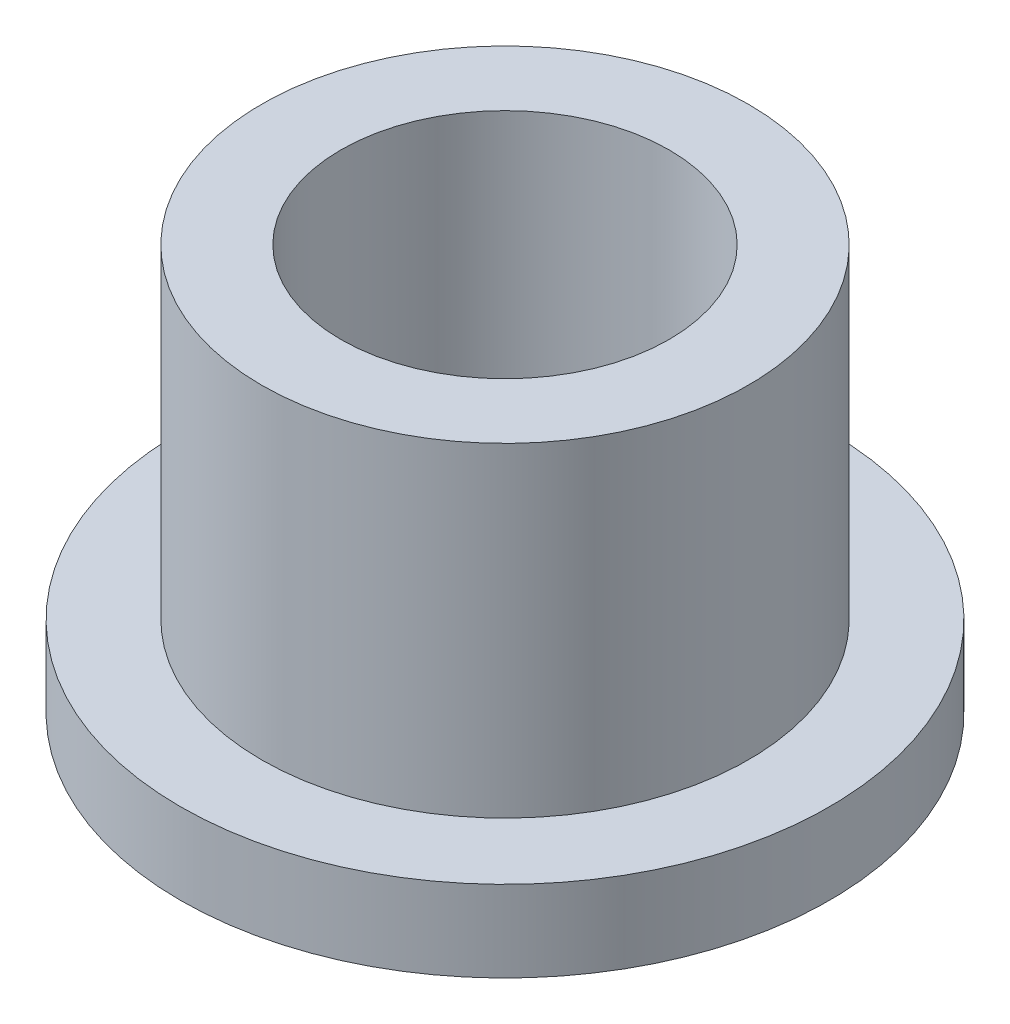
ISO-10303-21;
HEADER;
FILE_DESCRIPTION(('STEP AP214'),'2;1');
FILE_NAME('part.step','',(''),(''),'','','');
FILE_SCHEMA(('AUTOMOTIVE_DESIGN { 1 0 10303 214 1 1 1 1 }'));
ENDSEC;
DATA;
#1=APPLICATION_CONTEXT('core data for automotive mechanical design processes');
#2=APPLICATION_PROTOCOL_DEFINITION('international standard','automotive_design',2000,#1);
#3=PRODUCT_CONTEXT('',#1,'mechanical');
#4=PRODUCT('Part','Part','',(#3));
#5=PRODUCT_RELATED_PRODUCT_CATEGORY('part','',(#4));
#6=PRODUCT_DEFINITION_FORMATION('','',#4);
#7=PRODUCT_DEFINITION_CONTEXT('part definition',#1,'design');
#8=PRODUCT_DEFINITION('design','',#6,#7);
#9=PRODUCT_DEFINITION_SHAPE('','',#8);
#10=(LENGTH_UNIT() NAMED_UNIT(*) SI_UNIT(.MILLI.,.METRE.));
#11=(NAMED_UNIT(*) PLANE_ANGLE_UNIT() SI_UNIT($,.RADIAN.));
#12=(NAMED_UNIT(*) SI_UNIT($,.STERADIAN.) SOLID_ANGLE_UNIT());
#13=UNCERTAINTY_MEASURE_WITH_UNIT(LENGTH_MEASURE(1.E-05),#10,'distance_accuracy_value','');
#14=(GEOMETRIC_REPRESENTATION_CONTEXT(3) GLOBAL_UNCERTAINTY_ASSIGNED_CONTEXT((#13)) GLOBAL_UNIT_ASSIGNED_CONTEXT((#10,
#11,#12)) REPRESENTATION_CONTEXT('',''));
#15=CARTESIAN_POINT('',(0.,0.,0.));
#16=DIRECTION('',(0.,0.,1.));
#17=DIRECTION('',(1.,0.,0.));
#18=AXIS2_PLACEMENT_3D('',#15,#16,#17);
#19=CARTESIAN_POINT('',(0.,7.9375,0.));
#20=DIRECTION('',(0.,1.,0.));
#21=DIRECTION('',(0.,0.,1.));
#22=AXIS2_PLACEMENT_3D('',#19,#20,#21);
#23=PLANE('',#22);
#24=CARTESIAN_POINT('',(0.,7.9375,0.));
#25=DIRECTION('',(0.,1.,0.));
#26=DIRECTION('',(0.,0.,1.));
#27=AXIS2_PLACEMENT_3D('',#24,#25,#26);
#28=CIRCLE('',#27,4.7625);
#29=CARTESIAN_POINT('',(0.,7.9375,4.7625));
#30=VERTEX_POINT('',#29);
#31=EDGE_CURVE('E10',#30,#30,#28,.T.);
#32=ORIENTED_EDGE('',*,*,#31,.T.);
#33=EDGE_LOOP('',(#32));
#34=FACE_BOUND('',#33,.T.);
#35=CARTESIAN_POINT('',(0.,7.9375,0.));
#36=DIRECTION('',(0.,1.,0.));
#37=DIRECTION('',(0.,0.,1.));
#38=AXIS2_PLACEMENT_3D('',#35,#36,#37);
#39=CIRCLE('',#38,3.2131);
#40=CARTESIAN_POINT('',(0.,7.9375,3.2131));
#41=VERTEX_POINT('',#40);
#42=EDGE_CURVE('E37',#41,#41,#39,.T.);
#43=ORIENTED_EDGE('',*,*,#42,.F.);
#44=EDGE_LOOP('',(#43));
#45=FACE_BOUND('',#44,.T.);
#46=ADVANCED_FACE('F30',(#34,#45),#23,.T.);
#47=CARTESIAN_POINT('',(0.,0.,0.));
#48=DIRECTION('',(0.,1.,0.));
#49=DIRECTION('',(0.,0.,1.));
#50=AXIS2_PLACEMENT_3D('',#47,#48,#49);
#51=PLANE('',#50);
#52=CARTESIAN_POINT('',(0.,0.,0.));
#53=DIRECTION('',(0.,1.,0.));
#54=DIRECTION('',(0.,0.,1.));
#55=AXIS2_PLACEMENT_3D('',#52,#53,#54);
#56=CIRCLE('',#55,3.2131);
#57=CARTESIAN_POINT('',(0.,0.,3.2131));
#58=VERTEX_POINT('',#57);
#59=EDGE_CURVE('E41',#58,#58,#56,.T.);
#60=ORIENTED_EDGE('',*,*,#59,.T.);
#61=EDGE_LOOP('',(#60));
#62=FACE_BOUND('',#61,.T.);
#63=CARTESIAN_POINT('',(0.,0.,0.));
#64=DIRECTION('',(0.,1.,0.));
#65=DIRECTION('',(0.,0.,1.));
#66=AXIS2_PLACEMENT_3D('',#63,#64,#65);
#67=CIRCLE('',#66,6.35);
#68=CARTESIAN_POINT('',(0.,0.,6.35));
#69=VERTEX_POINT('',#68);
#70=EDGE_CURVE('E48',#69,#69,#67,.T.);
#71=ORIENTED_EDGE('',*,*,#70,.F.);
#72=EDGE_LOOP('',(#71));
#73=FACE_BOUND('',#72,.T.);
#74=ADVANCED_FACE('F73',(#62,#73),#51,.F.);
#75=CARTESIAN_POINT('',(0.,7.9375,0.));
#76=DIRECTION('',(0.,-1.,0.));
#77=DIRECTION('',(0.,0.,-1.));
#78=AXIS2_PLACEMENT_3D('',#75,#76,#77);
#79=CYLINDRICAL_SURFACE('',#78,4.7625);
#80=CARTESIAN_POINT('',(0.,1.5875,0.));
#81=DIRECTION('',(0.,1.,0.));
#82=DIRECTION('',(0.,0.,1.));
#83=AXIS2_PLACEMENT_3D('',#80,#81,#82);
#84=CIRCLE('',#83,4.7625);
#85=CARTESIAN_POINT('',(0.,1.5875,4.7625));
#86=VERTEX_POINT('',#85);
#87=EDGE_CURVE('E51',#86,#86,#84,.T.);
#88=ORIENTED_EDGE('',*,*,#87,.T.);
#89=EDGE_LOOP('',(#88));
#90=FACE_BOUND('',#89,.T.);
#91=ORIENTED_EDGE('',*,*,#31,.F.);
#92=EDGE_LOOP('',(#91));
#93=FACE_BOUND('',#92,.T.);
#94=ADVANCED_FACE('F32',(#90,#93),#79,.T.);
#95=CARTESIAN_POINT('',(0.,7.9375,0.));
#96=DIRECTION('',(0.,-1.,0.));
#97=DIRECTION('',(0.,0.,-1.));
#98=AXIS2_PLACEMENT_3D('',#95,#96,#97);
#99=CYLINDRICAL_SURFACE('',#98,3.2131);
#100=ORIENTED_EDGE('',*,*,#42,.T.);
#101=EDGE_LOOP('',(#100));
#102=FACE_BOUND('',#101,.T.);
#103=ORIENTED_EDGE('',*,*,#59,.F.);
#104=EDGE_LOOP('',(#103));
#105=FACE_BOUND('',#104,.T.);
#106=ADVANCED_FACE('F62',(#102,#105),#99,.F.);
#107=CARTESIAN_POINT('',(0.,1.5875,0.));
#108=DIRECTION('',(0.,1.,0.));
#109=DIRECTION('',(0.,0.,1.));
#110=AXIS2_PLACEMENT_3D('',#107,#108,#109);
#111=PLANE('',#110);
#112=CARTESIAN_POINT('',(0.,1.5875,0.));
#113=DIRECTION('',(0.,1.,0.));
#114=DIRECTION('',(0.,0.,1.));
#115=AXIS2_PLACEMENT_3D('',#112,#113,#114);
#116=CIRCLE('',#115,6.35);
#117=CARTESIAN_POINT('',(0.,1.5875,6.35));
#118=VERTEX_POINT('',#117);
#119=EDGE_CURVE('E46',#118,#118,#116,.T.);
#120=ORIENTED_EDGE('',*,*,#119,.T.);
#121=EDGE_LOOP('',(#120));
#122=FACE_BOUND('',#121,.T.);
#123=ORIENTED_EDGE('',*,*,#87,.F.);
#124=EDGE_LOOP('',(#123));
#125=FACE_BOUND('',#124,.T.);
#126=ADVANCED_FACE('F59',(#122,#125),#111,.T.);
#127=CARTESIAN_POINT('',(0.,1.5875,0.));
#128=DIRECTION('',(0.,-1.,0.));
#129=DIRECTION('',(0.,0.,-1.));
#130=AXIS2_PLACEMENT_3D('',#127,#128,#129);
#131=CYLINDRICAL_SURFACE('',#130,6.35);
#132=ORIENTED_EDGE('',*,*,#119,.F.);
#133=EDGE_LOOP('',(#132));
#134=FACE_BOUND('',#133,.T.);
#135=ORIENTED_EDGE('',*,*,#70,.T.);
#136=EDGE_LOOP('',(#135));
#137=FACE_BOUND('',#136,.T.);
#138=ADVANCED_FACE('F61',(#134,#137),#131,.T.);
#139=CLOSED_SHELL('',(#46,#74,#94,#106,#126,#138));
#140=MANIFOLD_SOLID_BREP('B2',#139);
#141=ADVANCED_BREP_SHAPE_REPRESENTATION('',(#18,#140),#14);
#142=SHAPE_DEFINITION_REPRESENTATION(#9,#141);
ENDSEC;
END-ISO-10303-21;
